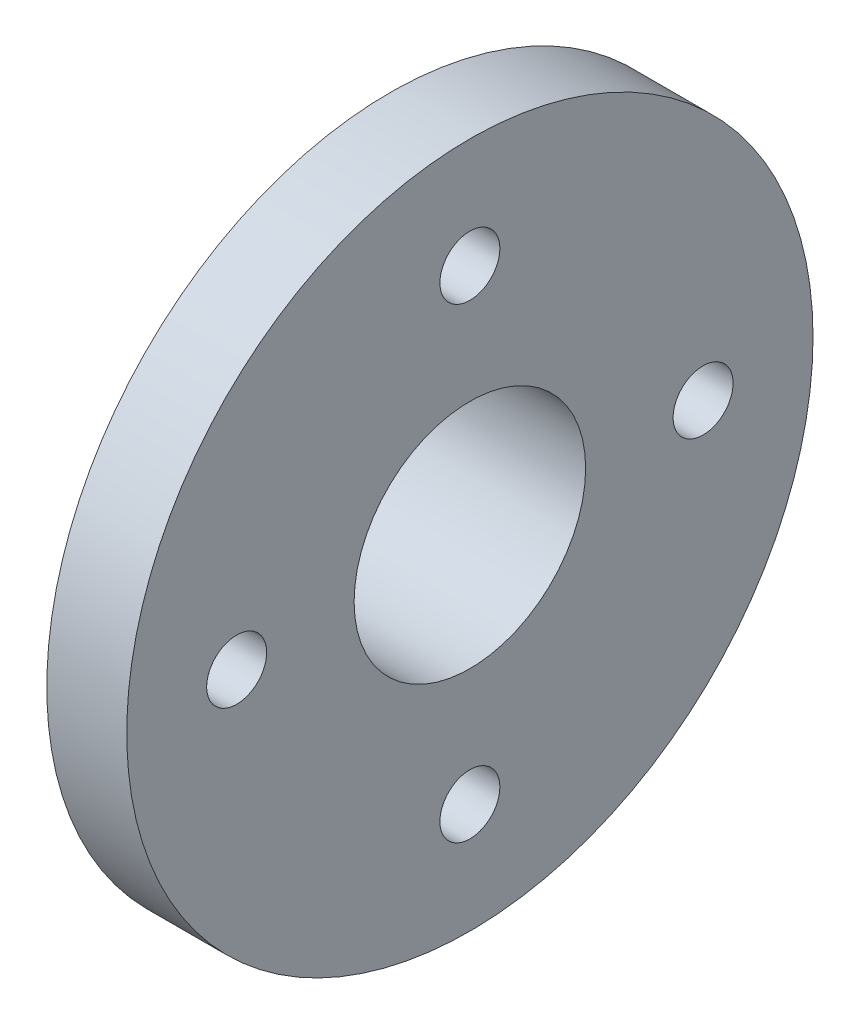
ISO-10303-21;
HEADER;
FILE_DESCRIPTION(('STEP AP214'),'2;1');
FILE_NAME('part.step','',(''),(''),'','','');
FILE_SCHEMA(('AUTOMOTIVE_DESIGN { 1 0 10303 214 1 1 1 1 }'));
ENDSEC;
DATA;
#1=APPLICATION_CONTEXT('core data for automotive mechanical design processes');
#2=APPLICATION_PROTOCOL_DEFINITION('international standard','automotive_design',2000,#1);
#3=PRODUCT_CONTEXT('',#1,'mechanical');
#4=PRODUCT('Part','Part','',(#3));
#5=PRODUCT_RELATED_PRODUCT_CATEGORY('part','',(#4));
#6=PRODUCT_DEFINITION_FORMATION('','',#4);
#7=PRODUCT_DEFINITION_CONTEXT('part definition',#1,'design');
#8=PRODUCT_DEFINITION('design','',#6,#7);
#9=PRODUCT_DEFINITION_SHAPE('','',#8);
#10=(LENGTH_UNIT() NAMED_UNIT(*) SI_UNIT(.MILLI.,.METRE.));
#11=(NAMED_UNIT(*) PLANE_ANGLE_UNIT() SI_UNIT($,.RADIAN.));
#12=(NAMED_UNIT(*) SI_UNIT($,.STERADIAN.) SOLID_ANGLE_UNIT());
#13=UNCERTAINTY_MEASURE_WITH_UNIT(LENGTH_MEASURE(1.E-05),#10,'distance_accuracy_value','');
#14=(GEOMETRIC_REPRESENTATION_CONTEXT(3) GLOBAL_UNCERTAINTY_ASSIGNED_CONTEXT((#13)) GLOBAL_UNIT_ASSIGNED_CONTEXT((#10,
#11,#12)) REPRESENTATION_CONTEXT('',''));
#15=CARTESIAN_POINT('',(0.,0.,0.));
#16=DIRECTION('',(0.,0.,1.));
#17=DIRECTION('',(1.,0.,0.));
#18=AXIS2_PLACEMENT_3D('',#15,#16,#17);
#19=CARTESIAN_POINT('',(19.9715077089559,-6.3830015724102,23.1862335999997));
#20=DIRECTION('',(-1.,-4.941628E-09,0.));
#21=DIRECTION('',(0.,0.,-1.));
#22=AXIS2_PLACEMENT_3D('',#19,#20,#21);
#23=PLANE('',#22);
#24=CARTESIAN_POINT('',(19.9715077599043,-16.6930015724102,12.8762335999997));
#25=DIRECTION('',(1.,4.94162877098821E-09,0.));
#26=DIRECTION('',(0.,0.,1.));
#27=AXIS2_PLACEMENT_3D('',#24,#25,#26);
#28=CIRCLE('',#27,4.50000000000002);
#29=CARTESIAN_POINT('',(19.9715077599042,-16.6930015724102,17.3762335999998));
#30=VERTEX_POINT('',#29);
#31=EDGE_CURVE('E186',#30,#30,#28,.T.);
#32=ORIENTED_EDGE('',*,*,#31,.T.);
#33=EDGE_LOOP('',(#32));
#34=FACE_BOUND('',#33,.T.);
#35=CARTESIAN_POINT('',(19.9715077599045,-16.6930015724107,5.87623359999974));
#36=DIRECTION('',(1.,4.94162414505894E-09,0.));
#37=DIRECTION('',(0.,0.,-1.));
#38=AXIS2_PLACEMENT_3D('',#35,#36,#37);
#39=CIRCLE('',#38,0.899999999999994);
#40=CARTESIAN_POINT('',(19.9715077599046,-16.6930015724107,4.97623359999974));
#41=VERTEX_POINT('',#40);
#42=EDGE_CURVE('E102',#41,#41,#39,.T.);
#43=ORIENTED_EDGE('',*,*,#42,.T.);
#44=EDGE_LOOP('',(#43));
#45=FACE_BOUND('',#44,.T.);
#46=CARTESIAN_POINT('',(19.9715077253128,-9.69300157241076,12.8762335999997));
#47=DIRECTION('',(1.,4.94164727470529E-09,0.));
#48=DIRECTION('',(0.,0.,-1.));
#49=AXIS2_PLACEMENT_3D('',#46,#47,#48);
#50=CIRCLE('',#49,0.900000000000038);
#51=CARTESIAN_POINT('',(19.9715077253128,-9.69300157241069,11.9762335999997));
#52=VERTEX_POINT('',#51);
#53=EDGE_CURVE('E122',#52,#52,#50,.T.);
#54=ORIENTED_EDGE('',*,*,#53,.T.);
#55=EDGE_LOOP('',(#54));
#56=FACE_BOUND('',#55,.T.);
#57=CARTESIAN_POINT('',(19.971507794496,-23.6930015724107,12.8762335999997));
#58=DIRECTION('',(1.,4.94161643517683E-09,0.));
#59=DIRECTION('',(0.,0.,-1.));
#60=AXIS2_PLACEMENT_3D('',#57,#58,#59);
#61=CIRCLE('',#60,0.899999999999988);
#62=CARTESIAN_POINT('',(19.971507794496,-23.6930015724107,11.9762335999997));
#63=VERTEX_POINT('',#62);
#64=EDGE_CURVE('E132',#63,#63,#61,.T.);
#65=ORIENTED_EDGE('',*,*,#64,.T.);
#66=EDGE_LOOP('',(#65));
#67=FACE_BOUND('',#66,.T.);
#68=CARTESIAN_POINT('',(19.9715077599042,-16.6930015724112,19.8762335999998));
#69=DIRECTION('',(1.,4.94160487035365E-09,0.));
#70=DIRECTION('',(0.,0.,-1.));
#71=AXIS2_PLACEMENT_3D('',#68,#69,#70);
#72=CIRCLE('',#71,0.900000000000034);
#73=CARTESIAN_POINT('',(19.9715077599042,-16.6930015724112,18.9762335999997));
#74=VERTEX_POINT('',#73);
#75=EDGE_CURVE('E142',#74,#74,#72,.T.);
#76=ORIENTED_EDGE('',*,*,#75,.T.);
#77=EDGE_LOOP('',(#76));
#78=FACE_BOUND('',#77,.T.);
#79=CARTESIAN_POINT('',(19.9715077599044,-16.6930015724102,12.8762335999997));
#80=DIRECTION('',(1.,4.94162665264196E-09,0.));
#81=DIRECTION('',(0.,0.,-1.));
#82=AXIS2_PLACEMENT_3D('',#79,#80,#81);
#83=CIRCLE('',#82,10.3);
#84=CARTESIAN_POINT('',(19.9715077599046,-16.6930015724102,2.57623359999974));
#85=VERTEX_POINT('',#84);
#86=EDGE_CURVE('E11',#85,#85,#83,.T.);
#87=ORIENTED_EDGE('',*,*,#86,.F.);
#88=EDGE_LOOP('',(#87));
#89=FACE_BOUND('',#88,.T.);
#90=ADVANCED_FACE('F42',(#34,#45,#56,#67,#78,#89),#23,.T.);
#91=CARTESIAN_POINT('',(22.3715077089564,-6.3830015605503,2.5662335999998));
#92=DIRECTION('',(1.,4.941628E-09,0.));
#93=DIRECTION('',(0.,0.,1.));
#94=AXIS2_PLACEMENT_3D('',#91,#92,#93);
#95=PLANE('',#94);
#96=CARTESIAN_POINT('',(22.3715077599044,-16.6930015605503,12.8762335999998));
#97=DIRECTION('',(-1.,-4.94160104314598E-09,0.));
#98=DIRECTION('',(0.,0.,-1.));
#99=AXIS2_PLACEMENT_3D('',#96,#97,#98);
#100=CIRCLE('',#99,3.47500000000002);
#101=CARTESIAN_POINT('',(22.3715077599045,-16.6930015605503,9.4012335999998));
#102=VERTEX_POINT('',#101);
#103=EDGE_CURVE('E179',#102,#102,#100,.T.);
#104=ORIENTED_EDGE('',*,*,#103,.T.);
#105=EDGE_LOOP('',(#104));
#106=FACE_BOUND('',#105,.T.);
#107=CARTESIAN_POINT('',(22.3715077599045,-16.6930015605508,5.87623359999979));
#108=DIRECTION('',(-1.,-4.94162414505894E-09,0.));
#109=DIRECTION('',(0.,1.07938349478686E-13,-1.));
#110=AXIS2_PLACEMENT_3D('',#107,#108,#109);
#111=CIRCLE('',#110,0.899999999999953);
#112=CARTESIAN_POINT('',(22.3715077599046,-16.6930015605507,4.9762335999998));
#113=VERTEX_POINT('',#112);
#114=EDGE_CURVE('E116',#113,#113,#111,.T.);
#115=ORIENTED_EDGE('',*,*,#114,.T.);
#116=EDGE_LOOP('',(#115));
#117=FACE_BOUND('',#116,.T.);
#118=CARTESIAN_POINT('',(22.3715077253128,-9.69300156055064,12.8762335999998));
#119=DIRECTION('',(-1.,-4.94164727470529E-09,0.));
#120=DIRECTION('',(0.,0.,-1.));
#121=AXIS2_PLACEMENT_3D('',#118,#119,#120);
#122=CIRCLE('',#121,0.900000000000037);
#123=CARTESIAN_POINT('',(22.3715077253128,-9.69300156055071,11.9762335999998));
#124=VERTEX_POINT('',#123);
#125=EDGE_CURVE('E129',#124,#124,#122,.T.);
#126=ORIENTED_EDGE('',*,*,#125,.T.);
#127=EDGE_LOOP('',(#126));
#128=FACE_BOUND('',#127,.T.);
#129=CARTESIAN_POINT('',(22.3715077944959,-23.6930015605507,12.8762335999998));
#130=DIRECTION('',(-1.,-4.94162414505894E-09,-1.23083408558607E-13));
#131=DIRECTION('',(1.23083408558607E-13,0.,-1.));
#132=AXIS2_PLACEMENT_3D('',#129,#130,#131);
#133=CIRCLE('',#132,0.9);
#134=CARTESIAN_POINT('',(22.371507794496,-23.6930015605507,11.9762335999998));
#135=VERTEX_POINT('',#134);
#136=EDGE_CURVE('E139',#135,#135,#133,.T.);
#137=ORIENTED_EDGE('',*,*,#136,.T.);
#138=EDGE_LOOP('',(#137));
#139=FACE_BOUND('',#138,.T.);
#140=CARTESIAN_POINT('',(22.3715077599042,-16.6930015605512,19.8762335999998));
#141=DIRECTION('',(-1.,-4.94163956482317E-09,0.));
#142=DIRECTION('',(0.,0.,-1.));
#143=AXIS2_PLACEMENT_3D('',#140,#141,#142);
#144=CIRCLE('',#143,0.90000000000003);
#145=CARTESIAN_POINT('',(22.3715077599042,-16.6930015605512,18.9762335999998));
#146=VERTEX_POINT('',#145);
#147=EDGE_CURVE('E46',#146,#146,#144,.T.);
#148=ORIENTED_EDGE('',*,*,#147,.T.);
#149=EDGE_LOOP('',(#148));
#150=FACE_BOUND('',#149,.T.);
#151=CARTESIAN_POINT('',(22.3715077599044,-16.6930015605503,12.8762335999998));
#152=DIRECTION('',(1.,4.94162698948147E-09,0.));
#153=DIRECTION('',(0.,0.,-1.));
#154=AXIS2_PLACEMENT_3D('',#151,#152,#153);
#155=CIRCLE('',#154,10.3);
#156=CARTESIAN_POINT('',(22.3715077599046,-16.6930015605503,2.5762335999998));
#157=VERTEX_POINT('',#156);
#158=EDGE_CURVE('E168',#157,#157,#155,.T.);
#159=ORIENTED_EDGE('',*,*,#158,.T.);
#160=EDGE_LOOP('',(#159));
#161=FACE_BOUND('',#160,.T.);
#162=ADVANCED_FACE('F158',(#106,#117,#128,#139,#150,#161),#95,.T.);
#163=CARTESIAN_POINT('',(22.3715077599044,-16.6930015605504,12.8762335999998));
#164=DIRECTION('',(-1.,-4.94162833683951E-09,0.));
#165=DIRECTION('',(0.,0.,-1.));
#166=AXIS2_PLACEMENT_3D('',#163,#164,#165);
#167=CYLINDRICAL_SURFACE('',#166,10.3);
#168=ORIENTED_EDGE('',*,*,#158,.F.);
#169=DIRECTION('',(-1.,-4.941628E-09,0.));
#170=VECTOR('',#169,1.);
#171=CARTESIAN_POINT('',(21.1715077599046,-16.6930015664803,2.57623359999977));
#172=LINE('',#171,#170);
#173=EDGE_CURVE('E53',#157,#85,#172,.T.);
#174=ORIENTED_EDGE('',*,*,#173,.T.);
#175=ORIENTED_EDGE('',*,*,#86,.T.);
#176=ORIENTED_EDGE('',*,*,#173,.F.);
#177=EDGE_LOOP('',(#168,#174,#175,#176));
#178=FACE_BOUND('',#177,.T.);
#179=ADVANCED_FACE('F166',(#178),#167,.T.);
#180=CARTESIAN_POINT('',(15.9715077599044,-16.6930015921768,12.8762335999997));
#181=DIRECTION('',(1.,4.941624006392E-09,0.));
#182=DIRECTION('',(0.,0.,1.));
#183=AXIS2_PLACEMENT_3D('',#180,#181,#182);
#184=CYLINDRICAL_SURFACE('',#183,3.47500000000005);
#185=ORIENTED_EDGE('',*,*,#103,.F.);
#186=DIRECTION('',(-1.,-4.941628E-09,0.));
#187=VECTOR('',#186,1.);
#188=CARTESIAN_POINT('',(19.1715077599045,-16.6930015763635,9.40123359999973));
#189=LINE('',#188,#187);
#190=CARTESIAN_POINT('',(15.9715077599045,-16.6930015921767,9.40123359999967));
#191=VERTEX_POINT('',#190);
#192=EDGE_CURVE('E174',#102,#191,#189,.T.);
#193=ORIENTED_EDGE('',*,*,#192,.T.);
#194=CARTESIAN_POINT('',(15.9715077599044,-16.6930015921767,12.8762335999997));
#195=DIRECTION('',(1.,4.941631993608E-09,0.));
#196=DIRECTION('',(0.,0.,-1.));
#197=AXIS2_PLACEMENT_3D('',#194,#195,#196);
#198=CIRCLE('',#197,3.47500000000002);
#199=EDGE_CURVE('E183',#191,#191,#198,.T.);
#200=ORIENTED_EDGE('',*,*,#199,.F.);
#201=ORIENTED_EDGE('',*,*,#192,.F.);
#202=EDGE_LOOP('',(#185,#193,#200,#201));
#203=FACE_BOUND('',#202,.T.);
#204=ADVANCED_FACE('F199',(#203),#184,.F.);
#205=CARTESIAN_POINT('',(15.9715077376176,-12.1830015921767,17.3862335999996));
#206=DIRECTION('',(-1.,-4.9416168454588E-09,0.));
#207=DIRECTION('',(0.,0.,-1.));
#208=AXIS2_PLACEMENT_3D('',#205,#206,#207);
#209=PLANE('',#208);
#210=ORIENTED_EDGE('',*,*,#199,.T.);
#211=EDGE_LOOP('',(#210));
#212=FACE_BOUND('',#211,.T.);
#213=CARTESIAN_POINT('',(15.9715077599043,-16.6930015921768,12.8762335999997));
#214=DIRECTION('',(-1.,-4.94160487035365E-09,0.));
#215=DIRECTION('',(0.,0.,1.));
#216=AXIS2_PLACEMENT_3D('',#213,#214,#215);
#217=CIRCLE('',#216,4.50000000000003);
#218=CARTESIAN_POINT('',(15.9715077599042,-16.6930015921767,17.3762335999997));
#219=VERTEX_POINT('',#218);
#220=EDGE_CURVE('E105',#219,#219,#217,.T.);
#221=ORIENTED_EDGE('',*,*,#220,.T.);
#222=EDGE_LOOP('',(#221));
#223=FACE_BOUND('',#222,.T.);
#224=ADVANCED_FACE('F197',(#212,#223),#209,.T.);
#225=CARTESIAN_POINT('',(15.9715077599044,-16.6930015921767,12.8762335999997));
#226=DIRECTION('',(1.,4.94163416790569E-09,0.));
#227=DIRECTION('',(0.,0.,1.));
#228=AXIS2_PLACEMENT_3D('',#225,#226,#227);
#229=CYLINDRICAL_SURFACE('',#228,4.50000000000001);
#230=ORIENTED_EDGE('',*,*,#220,.F.);
#231=DIRECTION('',(1.,4.941628E-09,0.));
#232=VECTOR('',#231,1.);
#233=CARTESIAN_POINT('',(17.9715077599042,-16.6930015822935,17.3762335999997));
#234=LINE('',#233,#232);
#235=EDGE_CURVE('E113',#219,#30,#234,.T.);
#236=ORIENTED_EDGE('',*,*,#235,.T.);
#237=ORIENTED_EDGE('',*,*,#31,.F.);
#238=ORIENTED_EDGE('',*,*,#235,.F.);
#239=EDGE_LOOP('',(#230,#236,#237,#238));
#240=FACE_BOUND('',#239,.T.);
#241=ADVANCED_FACE('F195',(#240),#229,.T.);
#242=CARTESIAN_POINT('',(22.3715077599045,-16.6930015605507,5.87623359999979));
#243=DIRECTION('',(-1.,-4.94162414505894E-09,0.));
#244=DIRECTION('',(0.,0.,-1.));
#245=AXIS2_PLACEMENT_3D('',#242,#243,#244);
#246=CYLINDRICAL_SURFACE('',#245,0.90000000000001);
#247=ORIENTED_EDGE('',*,*,#114,.F.);
#248=DIRECTION('',(-1.,-4.941669922484E-09,0.));
#249=VECTOR('',#248,1.);
#250=CARTESIAN_POINT('',(21.1715077599046,-16.6930015664807,4.97623359999977));
#251=LINE('',#250,#249);
#252=EDGE_CURVE('E98',#113,#41,#251,.T.);
#253=ORIENTED_EDGE('',*,*,#252,.T.);
#254=ORIENTED_EDGE('',*,*,#42,.F.);
#255=ORIENTED_EDGE('',*,*,#252,.F.);
#256=EDGE_LOOP('',(#247,#253,#254,#255));
#257=FACE_BOUND('',#256,.T.);
#258=ADVANCED_FACE('F206',(#257),#246,.F.);
#259=CARTESIAN_POINT('',(22.3715077253128,-9.69300156055073,12.8762335999998));
#260=DIRECTION('',(-1.,-4.94163185494106E-09,0.));
#261=DIRECTION('',(-4.94163185494106E-09,1.,0.));
#262=AXIS2_PLACEMENT_3D('',#259,#260,#261);
#263=CYLINDRICAL_SURFACE('',#262,0.899999999999997);
#264=ORIENTED_EDGE('',*,*,#125,.F.);
#265=DIRECTION('',(-1.,-4.9416570927583E-09,0.));
#266=VECTOR('',#265,1.);
#267=CARTESIAN_POINT('',(21.1715077253128,-9.6930015664807,11.9762335999998));
#268=LINE('',#267,#266);
#269=EDGE_CURVE('E125',#124,#52,#268,.T.);
#270=ORIENTED_EDGE('',*,*,#269,.T.);
#271=ORIENTED_EDGE('',*,*,#53,.F.);
#272=ORIENTED_EDGE('',*,*,#269,.F.);
#273=EDGE_LOOP('',(#264,#270,#271,#272));
#274=FACE_BOUND('',#273,.T.);
#275=ADVANCED_FACE('F214',(#274),#263,.F.);
#276=CARTESIAN_POINT('',(22.371507794496,-23.6930015605507,12.8762335999998));
#277=DIRECTION('',(-1.,-4.941628E-09,0.));
#278=DIRECTION('',(0.,0.,-1.));
#279=AXIS2_PLACEMENT_3D('',#276,#277,#278);
#280=CYLINDRICAL_SURFACE('',#279,0.89999999999999);
#281=ORIENTED_EDGE('',*,*,#136,.F.);
#282=DIRECTION('',(-1.,-4.941669922484E-09,0.));
#283=VECTOR('',#282,1.);
#284=CARTESIAN_POINT('',(21.171507794496,-23.6930015664807,11.9762335999998));
#285=LINE('',#284,#283);
#286=EDGE_CURVE('E135',#135,#63,#285,.T.);
#287=ORIENTED_EDGE('',*,*,#286,.T.);
#288=ORIENTED_EDGE('',*,*,#64,.F.);
#289=ORIENTED_EDGE('',*,*,#286,.F.);
#290=EDGE_LOOP('',(#281,#287,#288,#289));
#291=FACE_BOUND('',#290,.T.);
#292=ADVANCED_FACE('F216',(#291),#280,.F.);
#293=CARTESIAN_POINT('',(22.3715077599043,-16.6930015605512,19.8762335999998));
#294=DIRECTION('',(-1.,-4.94162414505894E-09,0.));
#295=DIRECTION('',(-4.94162414505894E-09,1.,0.));
#296=AXIS2_PLACEMENT_3D('',#293,#294,#295);
#297=CYLINDRICAL_SURFACE('',#296,0.900000000000031);
#298=ORIENTED_EDGE('',*,*,#147,.F.);
#299=DIRECTION('',(-1.,-4.94166919968255E-09,0.));
#300=VECTOR('',#299,1.);
#301=CARTESIAN_POINT('',(21.1715077599042,-16.6930015664812,18.9762335999998));
#302=LINE('',#301,#300);
#303=EDGE_CURVE('E144',#146,#74,#302,.T.);
#304=ORIENTED_EDGE('',*,*,#303,.T.);
#305=ORIENTED_EDGE('',*,*,#75,.F.);
#306=ORIENTED_EDGE('',*,*,#303,.F.);
#307=EDGE_LOOP('',(#298,#304,#305,#306));
#308=FACE_BOUND('',#307,.T.);
#309=ADVANCED_FACE('F44',(#308),#297,.F.);
#310=CLOSED_SHELL('',(#90,#162,#179,#204,#224,#241,#258,#275,#292,#309));
#311=MANIFOLD_SOLID_BREP('B2',#310);
#312=ADVANCED_BREP_SHAPE_REPRESENTATION('',(#18,#311),#14);
#313=SHAPE_DEFINITION_REPRESENTATION(#9,#312);
ENDSEC;
END-ISO-10303-21;
